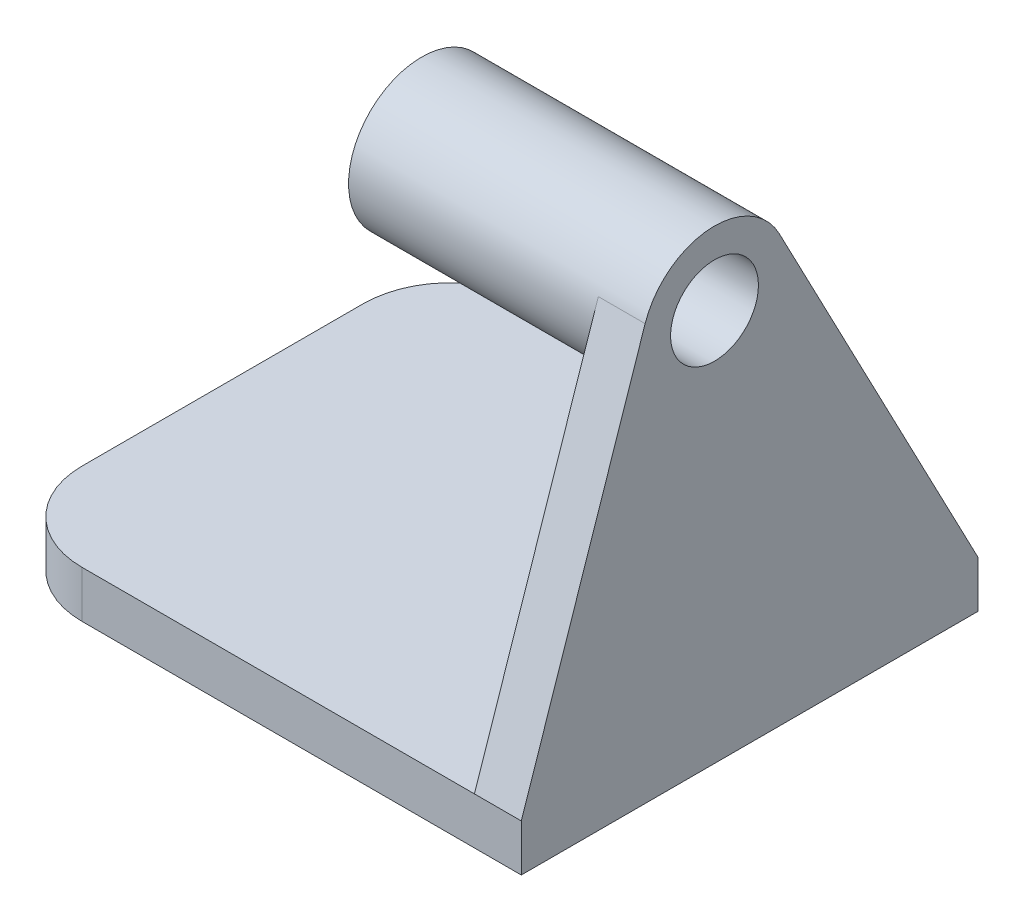
ISO-10303-21;
HEADER;
FILE_DESCRIPTION(('STEP AP214'),'2;1');
FILE_NAME('part.step','',(''),(''),'','','');
FILE_SCHEMA(('AUTOMOTIVE_DESIGN { 1 0 10303 214 1 1 1 1 }'));
ENDSEC;
DATA;
#1=APPLICATION_CONTEXT('core data for automotive mechanical design processes');
#2=APPLICATION_PROTOCOL_DEFINITION('international standard','automotive_design',2000,#1);
#3=PRODUCT_CONTEXT('',#1,'mechanical');
#4=PRODUCT('Part','Part','',(#3));
#5=PRODUCT_RELATED_PRODUCT_CATEGORY('part','',(#4));
#6=PRODUCT_DEFINITION_FORMATION('','',#4);
#7=PRODUCT_DEFINITION_CONTEXT('part definition',#1,'design');
#8=PRODUCT_DEFINITION('design','',#6,#7);
#9=PRODUCT_DEFINITION_SHAPE('','',#8);
#10=(LENGTH_UNIT() NAMED_UNIT(*) SI_UNIT(.MILLI.,.METRE.));
#11=(NAMED_UNIT(*) PLANE_ANGLE_UNIT() SI_UNIT($,.RADIAN.));
#12=(NAMED_UNIT(*) SI_UNIT($,.STERADIAN.) SOLID_ANGLE_UNIT());
#13=UNCERTAINTY_MEASURE_WITH_UNIT(LENGTH_MEASURE(1.E-05),#10,'distance_accuracy_value','');
#14=(GEOMETRIC_REPRESENTATION_CONTEXT(3) GLOBAL_UNCERTAINTY_ASSIGNED_CONTEXT((#13)) GLOBAL_UNIT_ASSIGNED_CONTEXT((#10,
#11,#12)) REPRESENTATION_CONTEXT('',''));
#15=CARTESIAN_POINT('',(0.,0.,0.));
#16=DIRECTION('',(0.,0.,1.));
#17=DIRECTION('',(1.,0.,0.));
#18=AXIS2_PLACEMENT_3D('',#15,#16,#17);
#19=CARTESIAN_POINT('',(0.,8.,0.));
#20=DIRECTION('',(0.,1.,0.));
#21=DIRECTION('',(0.,0.,1.));
#22=AXIS2_PLACEMENT_3D('',#19,#20,#21);
#23=PLANE('',#22);
#24=DIRECTION('',(-1.,0.,0.));
#25=VECTOR('',#24,1.);
#26=CARTESIAN_POINT('',(0.,8.,-78.));
#27=LINE('',#26,#25);
#28=CARTESIAN_POINT('',(81.9999999999999,8.,-78.));
#29=VERTEX_POINT('',#28);
#30=CARTESIAN_POINT('',(15.,8.,-78.));
#31=VERTEX_POINT('',#30);
#32=EDGE_CURVE('E152',#29,#31,#27,.T.);
#33=ORIENTED_EDGE('',*,*,#32,.T.);
#34=CARTESIAN_POINT('',(15.,8.,-63.));
#35=DIRECTION('',(0.,1.,0.));
#36=DIRECTION('',(0.,0.,1.));
#37=AXIS2_PLACEMENT_3D('',#34,#35,#36);
#38=CIRCLE('',#37,15.);
#39=CARTESIAN_POINT('',(0.,8.,-63.));
#40=VERTEX_POINT('',#39);
#41=EDGE_CURVE('E11',#31,#40,#38,.T.);
#42=ORIENTED_EDGE('',*,*,#41,.T.);
#43=DIRECTION('',(0.,0.,1.));
#44=VECTOR('',#43,1.);
#45=CARTESIAN_POINT('',(0.,8.,-78.));
#46=LINE('',#45,#44);
#47=CARTESIAN_POINT('',(0.,8.,-15.));
#48=VERTEX_POINT('',#47);
#49=EDGE_CURVE('E153',#40,#48,#46,.T.);
#50=ORIENTED_EDGE('',*,*,#49,.T.);
#51=CARTESIAN_POINT('',(15.,8.,-15.));
#52=DIRECTION('',(0.,1.,0.));
#53=DIRECTION('',(0.,0.,1.));
#54=AXIS2_PLACEMENT_3D('',#51,#52,#53);
#55=CIRCLE('',#54,15.);
#56=CARTESIAN_POINT('',(15.,8.,0.));
#57=VERTEX_POINT('',#56);
#58=EDGE_CURVE('E259',#48,#57,#55,.T.);
#59=ORIENTED_EDGE('',*,*,#58,.T.);
#60=DIRECTION('',(1.,0.,0.));
#61=VECTOR('',#60,1.);
#62=CARTESIAN_POINT('',(0.,8.,0.));
#63=LINE('',#62,#61);
#64=CARTESIAN_POINT('',(82.,8.,0.));
#65=VERTEX_POINT('',#64);
#66=EDGE_CURVE('E149',#57,#65,#63,.T.);
#67=ORIENTED_EDGE('',*,*,#66,.T.);
#68=DIRECTION('',(0.,0.,-1.));
#69=VECTOR('',#68,1.);
#70=CARTESIAN_POINT('',(82.,8.,-78.));
#71=LINE('',#70,#69);
#72=EDGE_CURVE('E111',#65,#29,#71,.T.);
#73=ORIENTED_EDGE('',*,*,#72,.T.);
#74=EDGE_LOOP('',(#33,#42,#50,#59,#67,#73));
#75=FACE_BOUND('',#74,.T.);
#76=ADVANCED_FACE('F33',(#75),#23,.T.);
#77=CARTESIAN_POINT('',(0.,8.,-78.));
#78=DIRECTION('',(1.,0.,0.));
#79=DIRECTION('',(0.,0.,-1.));
#80=AXIS2_PLACEMENT_3D('',#77,#78,#79);
#81=PLANE('',#80);
#82=ORIENTED_EDGE('',*,*,#49,.F.);
#83=DIRECTION('',(0.,-1.,0.));
#84=VECTOR('',#83,1.);
#85=CARTESIAN_POINT('',(0.,8.,-63.));
#86=LINE('',#85,#84);
#87=CARTESIAN_POINT('',(0.,0.,-63.));
#88=VERTEX_POINT('',#87);
#89=EDGE_CURVE('E256',#40,#88,#86,.T.);
#90=ORIENTED_EDGE('',*,*,#89,.T.);
#91=DIRECTION('',(0.,0.,1.));
#92=VECTOR('',#91,1.);
#93=CARTESIAN_POINT('',(0.,0.,-78.));
#94=LINE('',#93,#92);
#95=CARTESIAN_POINT('',(0.,0.,-15.));
#96=VERTEX_POINT('',#95);
#97=EDGE_CURVE('E161',#88,#96,#94,.T.);
#98=ORIENTED_EDGE('',*,*,#97,.T.);
#99=DIRECTION('',(0.,-1.,0.));
#100=VECTOR('',#99,1.);
#101=CARTESIAN_POINT('',(0.,8.,-15.));
#102=LINE('',#101,#100);
#103=EDGE_CURVE('E253',#96,#48,#102,.F.);
#104=ORIENTED_EDGE('',*,*,#103,.T.);
#105=EDGE_LOOP('',(#82,#90,#98,#104));
#106=FACE_BOUND('',#105,.T.);
#107=ADVANCED_FACE('F193',(#106),#81,.F.);
#108=CARTESIAN_POINT('',(0.,8.,0.));
#109=DIRECTION('',(0.,0.,-1.));
#110=DIRECTION('',(-1.,0.,0.));
#111=AXIS2_PLACEMENT_3D('',#108,#109,#110);
#112=PLANE('',#111);
#113=ORIENTED_EDGE('',*,*,#66,.F.);
#114=DIRECTION('',(0.,-1.,0.));
#115=VECTOR('',#114,1.);
#116=CARTESIAN_POINT('',(15.,8.,0.));
#117=LINE('',#116,#115);
#118=CARTESIAN_POINT('',(15.,0.,0.));
#119=VERTEX_POINT('',#118);
#120=EDGE_CURVE('E154',#57,#119,#117,.T.);
#121=ORIENTED_EDGE('',*,*,#120,.T.);
#122=DIRECTION('',(1.,0.,0.));
#123=VECTOR('',#122,1.);
#124=CARTESIAN_POINT('',(0.,0.,0.));
#125=LINE('',#124,#123);
#126=CARTESIAN_POINT('',(90.,0.,0.));
#127=VERTEX_POINT('',#126);
#128=EDGE_CURVE('E243',#119,#127,#125,.T.);
#129=ORIENTED_EDGE('',*,*,#128,.T.);
#130=DIRECTION('',(0.,-1.,0.));
#131=VECTOR('',#130,1.);
#132=CARTESIAN_POINT('',(90.,8.,0.));
#133=LINE('',#132,#131);
#134=CARTESIAN_POINT('',(90.,8.,0.));
#135=VERTEX_POINT('',#134);
#136=EDGE_CURVE('E239',#135,#127,#133,.T.);
#137=ORIENTED_EDGE('',*,*,#136,.F.);
#138=DIRECTION('',(1.,0.,0.));
#139=VECTOR('',#138,1.);
#140=CARTESIAN_POINT('',(82.,8.,0.));
#141=LINE('',#140,#139);
#142=EDGE_CURVE('E123',#65,#135,#141,.T.);
#143=ORIENTED_EDGE('',*,*,#142,.F.);
#144=EDGE_LOOP('',(#113,#121,#129,#137,#143));
#145=FACE_BOUND('',#144,.T.);
#146=ADVANCED_FACE('F189',(#145),#112,.F.);
#147=CARTESIAN_POINT('',(90.,8.,-78.));
#148=DIRECTION('',(-1.,0.,0.));
#149=DIRECTION('',(0.,0.,1.));
#150=AXIS2_PLACEMENT_3D('',#147,#148,#149);
#151=PLANE('',#150);
#152=DIRECTION('',(0.,0.,-1.));
#153=VECTOR('',#152,1.);
#154=CARTESIAN_POINT('',(90.,0.,-78.));
#155=LINE('',#154,#153);
#156=CARTESIAN_POINT('',(90.,0.,-78.));
#157=VERTEX_POINT('',#156);
#158=EDGE_CURVE('E238',#127,#157,#155,.T.);
#159=ORIENTED_EDGE('',*,*,#158,.T.);
#160=DIRECTION('',(0.,-1.,0.));
#161=VECTOR('',#160,1.);
#162=CARTESIAN_POINT('',(90.,8.,-78.));
#163=LINE('',#162,#161);
#164=CARTESIAN_POINT('',(90.,8.,-78.));
#165=VERTEX_POINT('',#164);
#166=EDGE_CURVE('E169',#165,#157,#163,.T.);
#167=ORIENTED_EDGE('',*,*,#166,.F.);
#168=DIRECTION('',(0.,0.885920291900568,0.46383751077162));
#169=VECTOR('',#168,1.);
#170=CARTESIAN_POINT('',(90.,72.7979688846453,-44.0740036487571));
#171=LINE('',#170,#169);
#172=CARTESIAN_POINT('',(90.,72.7979688846453,-44.0740036487571));
#173=VERTEX_POINT('',#172);
#174=EDGE_CURVE('E129',#165,#173,#171,.T.);
#175=ORIENTED_EDGE('',*,*,#174,.T.);
#176=CARTESIAN_POINT('',(90.,67.,-33.));
#177=DIRECTION('',(1.,0.,0.));
#178=DIRECTION('',(0.,0.,-1.));
#179=AXIS2_PLACEMENT_3D('',#176,#177,#178);
#180=CIRCLE('',#179,12.5);
#181=CARTESIAN_POINT('',(90.,70.9794583233895,-21.1503623915157));
#182=VERTEX_POINT('',#181);
#183=EDGE_CURVE('E135',#173,#182,#180,.T.);
#184=ORIENTED_EDGE('',*,*,#183,.T.);
#185=DIRECTION('',(0.,-0.947971008678745,0.318356665871163));
#186=VECTOR('',#185,1.);
#187=CARTESIAN_POINT('',(90.,8.,0.));
#188=LINE('',#187,#186);
#189=EDGE_CURVE('E119',#182,#135,#188,.T.);
#190=ORIENTED_EDGE('',*,*,#189,.T.);
#191=ORIENTED_EDGE('',*,*,#136,.T.);
#192=EDGE_LOOP('',(#159,#167,#175,#184,#190,#191));
#193=FACE_BOUND('',#192,.T.);
#194=CARTESIAN_POINT('',(90.,67.,-33.));
#195=DIRECTION('',(1.,0.,0.));
#196=DIRECTION('',(0.,0.,-1.));
#197=AXIS2_PLACEMENT_3D('',#194,#195,#196);
#198=CIRCLE('',#197,7.5);
#199=CARTESIAN_POINT('',(90.,67.,-40.5));
#200=VERTEX_POINT('',#199);
#201=EDGE_CURVE('E228',#200,#200,#198,.T.);
#202=ORIENTED_EDGE('',*,*,#201,.F.);
#203=EDGE_LOOP('',(#202));
#204=FACE_BOUND('',#203,.T.);
#205=ADVANCED_FACE('F182',(#193,#204),#151,.F.);
#206=CARTESIAN_POINT('',(0.,8.,-78.));
#207=DIRECTION('',(0.,0.,1.));
#208=DIRECTION('',(1.,0.,0.));
#209=AXIS2_PLACEMENT_3D('',#206,#207,#208);
#210=PLANE('',#209);
#211=DIRECTION('',(-1.,0.,0.));
#212=VECTOR('',#211,1.);
#213=CARTESIAN_POINT('',(0.,0.,-78.));
#214=LINE('',#213,#212);
#215=CARTESIAN_POINT('',(15.,0.,-78.));
#216=VERTEX_POINT('',#215);
#217=EDGE_CURVE('E179',#157,#216,#214,.T.);
#218=ORIENTED_EDGE('',*,*,#217,.T.);
#219=DIRECTION('',(0.,-1.,0.));
#220=VECTOR('',#219,1.);
#221=CARTESIAN_POINT('',(15.,8.,-78.));
#222=LINE('',#221,#220);
#223=EDGE_CURVE('E41',#216,#31,#222,.F.);
#224=ORIENTED_EDGE('',*,*,#223,.T.);
#225=ORIENTED_EDGE('',*,*,#32,.F.);
#226=EDGE_CURVE('E167',#165,#29,#27,.T.);
#227=ORIENTED_EDGE('',*,*,#226,.F.);
#228=ORIENTED_EDGE('',*,*,#166,.T.);
#229=EDGE_LOOP('',(#218,#224,#225,#227,#228));
#230=FACE_BOUND('',#229,.T.);
#231=ADVANCED_FACE('F178',(#230),#210,.F.);
#232=CARTESIAN_POINT('',(0.,0.,0.));
#233=DIRECTION('',(0.,1.,0.));
#234=DIRECTION('',(0.,0.,1.));
#235=AXIS2_PLACEMENT_3D('',#232,#233,#234);
#236=PLANE('',#235);
#237=ORIENTED_EDGE('',*,*,#97,.F.);
#238=CARTESIAN_POINT('',(15.,0.,-63.));
#239=DIRECTION('',(0.,1.,0.));
#240=DIRECTION('',(0.,0.,1.));
#241=AXIS2_PLACEMENT_3D('',#238,#239,#240);
#242=CIRCLE('',#241,15.);
#243=EDGE_CURVE('E55',#88,#216,#242,.F.);
#244=ORIENTED_EDGE('',*,*,#243,.T.);
#245=ORIENTED_EDGE('',*,*,#217,.F.);
#246=ORIENTED_EDGE('',*,*,#158,.F.);
#247=ORIENTED_EDGE('',*,*,#128,.F.);
#248=CARTESIAN_POINT('',(15.,0.,-15.));
#249=DIRECTION('',(0.,1.,0.));
#250=DIRECTION('',(0.,0.,1.));
#251=AXIS2_PLACEMENT_3D('',#248,#249,#250);
#252=CIRCLE('',#251,15.);
#253=EDGE_CURVE('E257',#119,#96,#252,.F.);
#254=ORIENTED_EDGE('',*,*,#253,.T.);
#255=EDGE_LOOP('',(#237,#244,#245,#246,#247,#254));
#256=FACE_BOUND('',#255,.T.);
#257=ADVANCED_FACE('F181',(#256),#236,.F.);
#258=CARTESIAN_POINT('',(82.,72.7979688846453,-44.0740036487571));
#259=DIRECTION('',(0.,0.46383751077162,-0.885920291900568));
#260=DIRECTION('',(0.,0.885920291900568,0.46383751077162));
#261=AXIS2_PLACEMENT_3D('',#258,#259,#260);
#262=PLANE('',#261);
#263=ORIENTED_EDGE('',*,*,#174,.F.);
#264=ORIENTED_EDGE('',*,*,#226,.T.);
#265=DIRECTION('',(0.,0.885920291900568,0.46383751077162));
#266=VECTOR('',#265,1.);
#267=CARTESIAN_POINT('',(82.,72.7979688846453,-44.0740036487571));
#268=LINE('',#267,#266);
#269=CARTESIAN_POINT('',(82.,72.7979688846453,-44.0740036487571));
#270=VERTEX_POINT('',#269);
#271=EDGE_CURVE('E124',#29,#270,#268,.T.);
#272=ORIENTED_EDGE('',*,*,#271,.T.);
#273=DIRECTION('',(1.,0.,0.));
#274=VECTOR('',#273,1.);
#275=CARTESIAN_POINT('',(82.,72.7979688846453,-44.0740036487571));
#276=LINE('',#275,#274);
#277=EDGE_CURVE('E128',#270,#173,#276,.T.);
#278=ORIENTED_EDGE('',*,*,#277,.T.);
#279=EDGE_LOOP('',(#263,#264,#272,#278));
#280=FACE_BOUND('',#279,.T.);
#281=ADVANCED_FACE('F171',(#280),#262,.T.);
#282=CARTESIAN_POINT('',(82.,8.,0.));
#283=DIRECTION('',(0.,0.318356665871163,0.947971008678745));
#284=DIRECTION('',(0.,-0.947971008678745,0.318356665871163));
#285=AXIS2_PLACEMENT_3D('',#282,#283,#284);
#286=PLANE('',#285);
#287=ORIENTED_EDGE('',*,*,#189,.F.);
#288=DIRECTION('',(1.,0.,0.));
#289=VECTOR('',#288,1.);
#290=CARTESIAN_POINT('',(82.,70.9794583233895,-21.1503623915157));
#291=LINE('',#290,#289);
#292=CARTESIAN_POINT('',(82.,70.9794583233895,-21.1503623915157));
#293=VERTEX_POINT('',#292);
#294=EDGE_CURVE('E116',#293,#182,#291,.T.);
#295=ORIENTED_EDGE('',*,*,#294,.F.);
#296=DIRECTION('',(0.,-0.947971008678745,0.318356665871163));
#297=VECTOR('',#296,1.);
#298=CARTESIAN_POINT('',(82.,8.,0.));
#299=LINE('',#298,#297);
#300=EDGE_CURVE('E104',#293,#65,#299,.T.);
#301=ORIENTED_EDGE('',*,*,#300,.T.);
#302=ORIENTED_EDGE('',*,*,#142,.T.);
#303=EDGE_LOOP('',(#287,#295,#301,#302));
#304=FACE_BOUND('',#303,.T.);
#305=ADVANCED_FACE('F117',(#304),#286,.T.);
#306=CARTESIAN_POINT('',(82.,67.,-33.));
#307=DIRECTION('',(1.,0.,0.));
#308=DIRECTION('',(0.,0.,-1.));
#309=AXIS2_PLACEMENT_3D('',#306,#307,#308);
#310=PLANE('',#309);
#311=CARTESIAN_POINT('',(82.,67.,-33.));
#312=DIRECTION('',(-1.,0.,0.));
#313=DIRECTION('',(0.,0.,-1.));
#314=AXIS2_PLACEMENT_3D('',#311,#312,#313);
#315=CIRCLE('',#314,12.5);
#316=EDGE_CURVE('E108',#270,#293,#315,.T.);
#317=ORIENTED_EDGE('',*,*,#316,.F.);
#318=ORIENTED_EDGE('',*,*,#271,.F.);
#319=ORIENTED_EDGE('',*,*,#72,.F.);
#320=ORIENTED_EDGE('',*,*,#300,.F.);
#321=EDGE_LOOP('',(#317,#318,#319,#320));
#322=FACE_BOUND('',#321,.T.);
#323=ADVANCED_FACE('F106',(#322),#310,.F.);
#324=CARTESIAN_POINT('',(40.,67.,-33.));
#325=DIRECTION('',(1.,0.,0.));
#326=DIRECTION('',(0.,0.,-1.));
#327=AXIS2_PLACEMENT_3D('',#324,#325,#326);
#328=CYLINDRICAL_SURFACE('',#327,12.5);
#329=CARTESIAN_POINT('',(40.,67.,-33.));
#330=DIRECTION('',(1.,0.,0.));
#331=DIRECTION('',(0.,0.,-1.));
#332=AXIS2_PLACEMENT_3D('',#329,#330,#331);
#333=CIRCLE('',#332,12.5);
#334=CARTESIAN_POINT('',(40.,67.,-45.5));
#335=VERTEX_POINT('',#334);
#336=EDGE_CURVE('E232',#335,#335,#333,.T.);
#337=ORIENTED_EDGE('',*,*,#336,.T.);
#338=EDGE_LOOP('',(#337));
#339=FACE_BOUND('',#338,.T.);
#340=ORIENTED_EDGE('',*,*,#277,.F.);
#341=ORIENTED_EDGE('',*,*,#316,.T.);
#342=ORIENTED_EDGE('',*,*,#294,.T.);
#343=ORIENTED_EDGE('',*,*,#183,.F.);
#344=EDGE_LOOP('',(#340,#341,#342,#343));
#345=FACE_BOUND('',#344,.T.);
#346=ADVANCED_FACE('F127',(#339,#345),#328,.T.);
#347=CARTESIAN_POINT('',(40.,67.,-33.));
#348=DIRECTION('',(1.,0.,0.));
#349=DIRECTION('',(0.,0.,-1.));
#350=AXIS2_PLACEMENT_3D('',#347,#348,#349);
#351=PLANE('',#350);
#352=CARTESIAN_POINT('',(40.,67.,-33.));
#353=DIRECTION('',(1.,0.,0.));
#354=DIRECTION('',(0.,0.,-1.));
#355=AXIS2_PLACEMENT_3D('',#352,#353,#354);
#356=CIRCLE('',#355,7.5);
#357=CARTESIAN_POINT('',(40.,67.,-40.5));
#358=VERTEX_POINT('',#357);
#359=EDGE_CURVE('E225',#358,#358,#356,.T.);
#360=ORIENTED_EDGE('',*,*,#359,.T.);
#361=EDGE_LOOP('',(#360));
#362=FACE_BOUND('',#361,.T.);
#363=ORIENTED_EDGE('',*,*,#336,.F.);
#364=EDGE_LOOP('',(#363));
#365=FACE_BOUND('',#364,.T.);
#366=ADVANCED_FACE('F209',(#362,#365),#351,.F.);
#367=CARTESIAN_POINT('',(40.,67.,-33.));
#368=DIRECTION('',(1.,0.,0.));
#369=DIRECTION('',(0.,0.,-1.));
#370=AXIS2_PLACEMENT_3D('',#367,#368,#369);
#371=CYLINDRICAL_SURFACE('',#370,7.5);
#372=ORIENTED_EDGE('',*,*,#359,.F.);
#373=EDGE_LOOP('',(#372));
#374=FACE_BOUND('',#373,.T.);
#375=ORIENTED_EDGE('',*,*,#201,.T.);
#376=EDGE_LOOP('',(#375));
#377=FACE_BOUND('',#376,.T.);
#378=ADVANCED_FACE('F213',(#374,#377),#371,.F.);
#379=CARTESIAN_POINT('',(15.,8.,-15.));
#380=DIRECTION('',(0.,-1.,0.));
#381=DIRECTION('',(0.,0.,-1.));
#382=AXIS2_PLACEMENT_3D('',#379,#380,#381);
#383=CYLINDRICAL_SURFACE('',#382,15.);
#384=ORIENTED_EDGE('',*,*,#58,.F.);
#385=ORIENTED_EDGE('',*,*,#103,.F.);
#386=ORIENTED_EDGE('',*,*,#253,.F.);
#387=ORIENTED_EDGE('',*,*,#120,.F.);
#388=EDGE_LOOP('',(#384,#385,#386,#387));
#389=FACE_BOUND('',#388,.T.);
#390=ADVANCED_FACE('F216',(#389),#383,.T.);
#391=CARTESIAN_POINT('',(15.,8.,-63.));
#392=DIRECTION('',(0.,-1.,0.));
#393=DIRECTION('',(0.,0.,-1.));
#394=AXIS2_PLACEMENT_3D('',#391,#392,#393);
#395=CYLINDRICAL_SURFACE('',#394,15.);
#396=ORIENTED_EDGE('',*,*,#41,.F.);
#397=ORIENTED_EDGE('',*,*,#223,.F.);
#398=ORIENTED_EDGE('',*,*,#243,.F.);
#399=ORIENTED_EDGE('',*,*,#89,.F.);
#400=EDGE_LOOP('',(#396,#397,#398,#399));
#401=FACE_BOUND('',#400,.T.);
#402=ADVANCED_FACE('F35',(#401),#395,.T.);
#403=CLOSED_SHELL('',(#76,#107,#146,#205,#231,#257,#281,#305,#323,#346,#366,#378,#390,#402));
#404=MANIFOLD_SOLID_BREP('B2',#403);
#405=ADVANCED_BREP_SHAPE_REPRESENTATION('',(#18,#404),#14);
#406=SHAPE_DEFINITION_REPRESENTATION(#9,#405);
ENDSEC;
END-ISO-10303-21;
